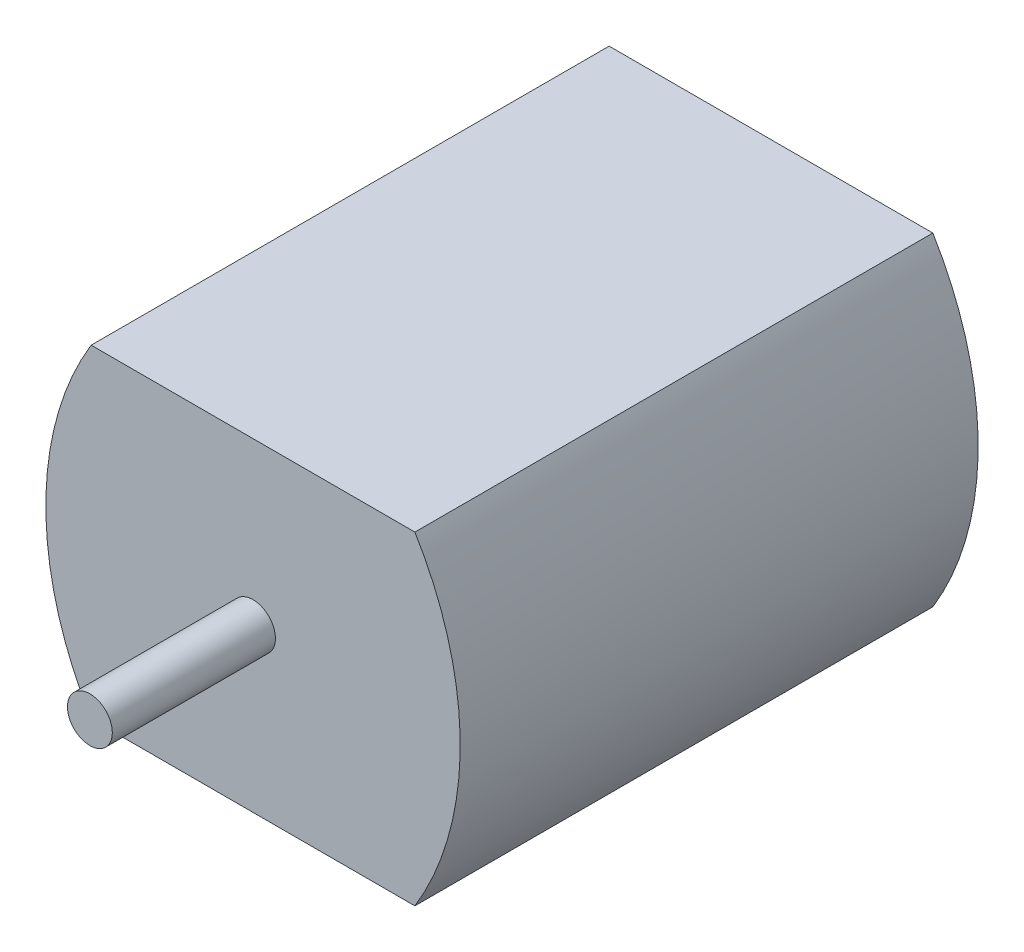
ISO-10303-21;
HEADER;
FILE_DESCRIPTION(('STEP AP214'),'2;1');
FILE_NAME('part.step','',(''),(''),'','','');
FILE_SCHEMA(('AUTOMOTIVE_DESIGN { 1 0 10303 214 1 1 1 1 }'));
ENDSEC;
DATA;
#1=APPLICATION_CONTEXT('core data for automotive mechanical design processes');
#2=APPLICATION_PROTOCOL_DEFINITION('international standard','automotive_design',2000,#1);
#3=PRODUCT_CONTEXT('',#1,'mechanical');
#4=PRODUCT('Part','Part','',(#3));
#5=PRODUCT_RELATED_PRODUCT_CATEGORY('part','',(#4));
#6=PRODUCT_DEFINITION_FORMATION('','',#4);
#7=PRODUCT_DEFINITION_CONTEXT('part definition',#1,'design');
#8=PRODUCT_DEFINITION('design','',#6,#7);
#9=PRODUCT_DEFINITION_SHAPE('','',#8);
#10=(LENGTH_UNIT() NAMED_UNIT(*) SI_UNIT(.MILLI.,.METRE.));
#11=(NAMED_UNIT(*) PLANE_ANGLE_UNIT() SI_UNIT($,.RADIAN.));
#12=(NAMED_UNIT(*) SI_UNIT($,.STERADIAN.) SOLID_ANGLE_UNIT());
#13=UNCERTAINTY_MEASURE_WITH_UNIT(LENGTH_MEASURE(1.E-05),#10,'distance_accuracy_value','');
#14=(GEOMETRIC_REPRESENTATION_CONTEXT(3) GLOBAL_UNCERTAINTY_ASSIGNED_CONTEXT((#13)) GLOBAL_UNIT_ASSIGNED_CONTEXT((#10,
#11,#12)) REPRESENTATION_CONTEXT('',''));
#15=CARTESIAN_POINT('',(0.,0.,0.));
#16=DIRECTION('',(0.,0.,1.));
#17=DIRECTION('',(1.,0.,0.));
#18=AXIS2_PLACEMENT_3D('',#15,#16,#17);
#19=CARTESIAN_POINT('',(-2.81214285714287,7.9375,25.4));
#20=DIRECTION('',(0.,0.,-1.));
#21=DIRECTION('',(-1.,0.,0.));
#22=AXIS2_PLACEMENT_3D('',#19,#20,#21);
#23=CYLINDRICAL_SURFACE('',#22,15.2853571428571);
#24=CARTESIAN_POINT('',(-2.81214285714287,7.9375,0.));
#25=DIRECTION('',(0.,0.,1.));
#26=DIRECTION('',(-1.,0.,0.));
#27=AXIS2_PLACEMENT_3D('',#24,#25,#26);
#28=CIRCLE('',#27,15.2853571428571);
#29=CARTESIAN_POINT('',(-15.875,15.875,0.));
#30=VERTEX_POINT('',#29);
#31=CARTESIAN_POINT('',(-15.875,0.,0.));
#32=VERTEX_POINT('',#31);
#33=EDGE_CURVE('E110',#30,#32,#28,.T.);
#34=ORIENTED_EDGE('',*,*,#33,.T.);
#35=DIRECTION('',(0.,0.,-1.));
#36=VECTOR('',#35,1.);
#37=CARTESIAN_POINT('',(-15.875,0.,25.4));
#38=LINE('',#37,#36);
#39=CARTESIAN_POINT('',(-15.875,0.,25.4));
#40=VERTEX_POINT('',#39);
#41=EDGE_CURVE('E48',#40,#32,#38,.T.);
#42=ORIENTED_EDGE('',*,*,#41,.F.);
#43=CARTESIAN_POINT('',(-2.81214285714287,7.9375,25.4));
#44=DIRECTION('',(0.,0.,1.));
#45=DIRECTION('',(-1.,0.,0.));
#46=AXIS2_PLACEMENT_3D('',#43,#44,#45);
#47=CIRCLE('',#46,15.2853571428571);
#48=CARTESIAN_POINT('',(-15.875,15.875,25.4));
#49=VERTEX_POINT('',#48);
#50=EDGE_CURVE('E92',#49,#40,#47,.T.);
#51=ORIENTED_EDGE('',*,*,#50,.F.);
#52=DIRECTION('',(0.,0.,-1.));
#53=VECTOR('',#52,1.);
#54=CARTESIAN_POINT('',(-15.875,15.875,25.4));
#55=LINE('',#54,#53);
#56=EDGE_CURVE('E106',#49,#30,#55,.T.);
#57=ORIENTED_EDGE('',*,*,#56,.T.);
#58=EDGE_LOOP('',(#34,#42,#51,#57));
#59=FACE_BOUND('',#58,.T.);
#60=ADVANCED_FACE('F39',(#59),#23,.T.);
#61=CARTESIAN_POINT('',(0.,0.,25.4));
#62=DIRECTION('',(0.,1.,0.));
#63=DIRECTION('',(0.,0.,1.));
#64=AXIS2_PLACEMENT_3D('',#61,#62,#63);
#65=PLANE('',#64);
#66=DIRECTION('',(1.,0.,0.));
#67=VECTOR('',#66,1.);
#68=CARTESIAN_POINT('',(0.,0.,0.));
#69=LINE('',#68,#67);
#70=CARTESIAN_POINT('',(0.,0.,0.));
#71=VERTEX_POINT('',#70);
#72=EDGE_CURVE('E98',#32,#71,#69,.T.);
#73=ORIENTED_EDGE('',*,*,#72,.T.);
#74=DIRECTION('',(0.,0.,-1.));
#75=VECTOR('',#74,1.);
#76=CARTESIAN_POINT('',(0.,0.,25.4));
#77=LINE('',#76,#75);
#78=CARTESIAN_POINT('',(0.,0.,25.4));
#79=VERTEX_POINT('',#78);
#80=EDGE_CURVE('E96',#79,#71,#77,.T.);
#81=ORIENTED_EDGE('',*,*,#80,.F.);
#82=DIRECTION('',(1.,0.,0.));
#83=VECTOR('',#82,1.);
#84=CARTESIAN_POINT('',(0.,0.,25.4));
#85=LINE('',#84,#83);
#86=EDGE_CURVE('E87',#40,#79,#85,.T.);
#87=ORIENTED_EDGE('',*,*,#86,.F.);
#88=ORIENTED_EDGE('',*,*,#41,.T.);
#89=EDGE_LOOP('',(#73,#81,#87,#88));
#90=FACE_BOUND('',#89,.T.);
#91=ADVANCED_FACE('F97',(#90),#65,.F.);
#92=CARTESIAN_POINT('',(-13.0628571428571,7.9375,25.4));
#93=DIRECTION('',(0.,0.,-1.));
#94=DIRECTION('',(-1.,0.,0.));
#95=AXIS2_PLACEMENT_3D('',#92,#93,#94);
#96=CYLINDRICAL_SURFACE('',#95,15.2853571428571);
#97=CARTESIAN_POINT('',(-13.0628571428571,7.9375,0.));
#98=DIRECTION('',(0.,0.,1.));
#99=DIRECTION('',(1.,0.,0.));
#100=AXIS2_PLACEMENT_3D('',#97,#98,#99);
#101=CIRCLE('',#100,15.2853571428571);
#102=CARTESIAN_POINT('',(0.,15.875,0.));
#103=VERTEX_POINT('',#102);
#104=EDGE_CURVE('E73',#71,#103,#101,.T.);
#105=ORIENTED_EDGE('',*,*,#104,.T.);
#106=DIRECTION('',(0.,0.,-1.));
#107=VECTOR('',#106,1.);
#108=CARTESIAN_POINT('',(0.,15.875,25.4));
#109=LINE('',#108,#107);
#110=CARTESIAN_POINT('',(0.,15.875,25.4));
#111=VERTEX_POINT('',#110);
#112=EDGE_CURVE('E100',#111,#103,#109,.T.);
#113=ORIENTED_EDGE('',*,*,#112,.F.);
#114=CARTESIAN_POINT('',(-13.0628571428571,7.9375,25.4));
#115=DIRECTION('',(0.,0.,1.));
#116=DIRECTION('',(1.,0.,0.));
#117=AXIS2_PLACEMENT_3D('',#114,#115,#116);
#118=CIRCLE('',#117,15.2853571428571);
#119=EDGE_CURVE('E90',#79,#111,#118,.T.);
#120=ORIENTED_EDGE('',*,*,#119,.F.);
#121=ORIENTED_EDGE('',*,*,#80,.T.);
#122=EDGE_LOOP('',(#105,#113,#120,#121));
#123=FACE_BOUND('',#122,.T.);
#124=ADVANCED_FACE('F102',(#123),#96,.T.);
#125=CARTESIAN_POINT('',(0.,15.875,25.4));
#126=DIRECTION('',(0.,-1.,0.));
#127=DIRECTION('',(0.,0.,-1.));
#128=AXIS2_PLACEMENT_3D('',#125,#126,#127);
#129=PLANE('',#128);
#130=DIRECTION('',(-1.,0.,0.));
#131=VECTOR('',#130,1.);
#132=CARTESIAN_POINT('',(0.,15.875,0.));
#133=LINE('',#132,#131);
#134=EDGE_CURVE('E79',#103,#30,#133,.T.);
#135=ORIENTED_EDGE('',*,*,#134,.T.);
#136=ORIENTED_EDGE('',*,*,#56,.F.);
#137=DIRECTION('',(-1.,0.,0.));
#138=VECTOR('',#137,1.);
#139=CARTESIAN_POINT('',(0.,15.875,25.4));
#140=LINE('',#139,#138);
#141=EDGE_CURVE('E56',#111,#49,#140,.T.);
#142=ORIENTED_EDGE('',*,*,#141,.F.);
#143=ORIENTED_EDGE('',*,*,#112,.T.);
#144=EDGE_LOOP('',(#135,#136,#142,#143));
#145=FACE_BOUND('',#144,.T.);
#146=ADVANCED_FACE('F139',(#145),#129,.F.);
#147=CARTESIAN_POINT('',(-2.81214285714287,7.9375,25.4));
#148=DIRECTION('',(0.,0.,-1.));
#149=DIRECTION('',(-1.,0.,0.));
#150=AXIS2_PLACEMENT_3D('',#147,#148,#149);
#151=PLANE('',#150);
#152=CARTESIAN_POINT('',(-7.9375,7.9375,25.4));
#153=DIRECTION('',(0.,0.,-1.));
#154=DIRECTION('',(-1.,0.,0.));
#155=AXIS2_PLACEMENT_3D('',#152,#153,#154);
#156=CIRCLE('',#155,1.1);
#157=CARTESIAN_POINT('',(-9.0375,7.9375,25.4));
#158=VERTEX_POINT('',#157);
#159=EDGE_CURVE('E11',#158,#158,#156,.F.);
#160=ORIENTED_EDGE('',*,*,#159,.F.);
#161=EDGE_LOOP('',(#160));
#162=FACE_BOUND('',#161,.T.);
#163=ORIENTED_EDGE('',*,*,#50,.T.);
#164=ORIENTED_EDGE('',*,*,#86,.T.);
#165=ORIENTED_EDGE('',*,*,#119,.T.);
#166=ORIENTED_EDGE('',*,*,#141,.T.);
#167=EDGE_LOOP('',(#163,#164,#165,#166));
#168=FACE_BOUND('',#167,.T.);
#169=ADVANCED_FACE('F88',(#162,#168),#151,.F.);
#170=CARTESIAN_POINT('',(-2.81214285714287,7.9375,0.));
#171=DIRECTION('',(0.,0.,-1.));
#172=DIRECTION('',(-1.,0.,0.));
#173=AXIS2_PLACEMENT_3D('',#170,#171,#172);
#174=PLANE('',#173);
#175=ORIENTED_EDGE('',*,*,#33,.F.);
#176=ORIENTED_EDGE('',*,*,#134,.F.);
#177=ORIENTED_EDGE('',*,*,#104,.F.);
#178=ORIENTED_EDGE('',*,*,#72,.F.);
#179=EDGE_LOOP('',(#175,#176,#177,#178));
#180=FACE_BOUND('',#179,.T.);
#181=ADVANCED_FACE('F128',(#180),#174,.T.);
#182=CARTESIAN_POINT('',(-7.9375,7.9375,33.4));
#183=DIRECTION('',(0.,0.,-1.));
#184=DIRECTION('',(-1.,0.,0.));
#185=AXIS2_PLACEMENT_3D('',#182,#183,#184);
#186=CYLINDRICAL_SURFACE('',#185,1.1);
#187=CARTESIAN_POINT('',(-7.9375,7.9375,33.4));
#188=DIRECTION('',(0.,0.,1.));
#189=DIRECTION('',(1.,0.,0.));
#190=AXIS2_PLACEMENT_3D('',#187,#188,#189);
#191=CIRCLE('',#190,1.1);
#192=CARTESIAN_POINT('',(-6.8375,7.9375,33.4));
#193=VERTEX_POINT('',#192);
#194=EDGE_CURVE('E114',#193,#193,#191,.T.);
#195=ORIENTED_EDGE('',*,*,#194,.F.);
#196=EDGE_LOOP('',(#195));
#197=FACE_BOUND('',#196,.T.);
#198=ORIENTED_EDGE('',*,*,#159,.T.);
#199=EDGE_LOOP('',(#198));
#200=FACE_BOUND('',#199,.T.);
#201=ADVANCED_FACE('F130',(#197,#200),#186,.T.);
#202=CARTESIAN_POINT('',(-7.9375,7.9375,33.4));
#203=DIRECTION('',(0.,0.,1.));
#204=DIRECTION('',(1.,0.,0.));
#205=AXIS2_PLACEMENT_3D('',#202,#203,#204);
#206=PLANE('',#205);
#207=ORIENTED_EDGE('',*,*,#194,.T.);
#208=EDGE_LOOP('',(#207));
#209=FACE_BOUND('',#208,.T.);
#210=ADVANCED_FACE('F136',(#209),#206,.T.);
#211=CLOSED_SHELL('',(#60,#91,#124,#146,#169,#181,#201,#210));
#212=MANIFOLD_SOLID_BREP('B2',#211);
#213=ADVANCED_BREP_SHAPE_REPRESENTATION('',(#18,#212),#14);
#214=SHAPE_DEFINITION_REPRESENTATION(#9,#213);
ENDSEC;
END-ISO-10303-21;
